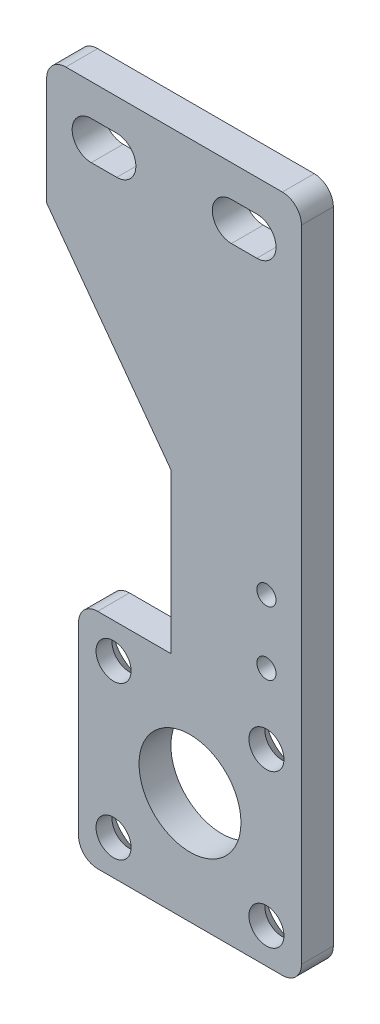
ISO-10303-21;
HEADER;
FILE_DESCRIPTION(('STEP AP214'),'2;1');
FILE_NAME('part.step','',(''),(''),'','','');
FILE_SCHEMA(('AUTOMOTIVE_DESIGN { 1 0 10303 214 1 1 1 1 }'));
ENDSEC;
DATA;
#1=APPLICATION_CONTEXT('core data for automotive mechanical design processes');
#2=APPLICATION_PROTOCOL_DEFINITION('international standard','automotive_design',2000,#1);
#3=PRODUCT_CONTEXT('',#1,'mechanical');
#4=PRODUCT('Part','Part','',(#3));
#5=PRODUCT_RELATED_PRODUCT_CATEGORY('part','',(#4));
#6=PRODUCT_DEFINITION_FORMATION('','',#4);
#7=PRODUCT_DEFINITION_CONTEXT('part definition',#1,'design');
#8=PRODUCT_DEFINITION('design','',#6,#7);
#9=PRODUCT_DEFINITION_SHAPE('','',#8);
#10=(LENGTH_UNIT() NAMED_UNIT(*) SI_UNIT(.MILLI.,.METRE.));
#11=(NAMED_UNIT(*) PLANE_ANGLE_UNIT() SI_UNIT($,.RADIAN.));
#12=(NAMED_UNIT(*) SI_UNIT($,.STERADIAN.) SOLID_ANGLE_UNIT());
#13=UNCERTAINTY_MEASURE_WITH_UNIT(LENGTH_MEASURE(1.E-05),#10,'distance_accuracy_value','');
#14=(GEOMETRIC_REPRESENTATION_CONTEXT(3) GLOBAL_UNCERTAINTY_ASSIGNED_CONTEXT((#13)) GLOBAL_UNIT_ASSIGNED_CONTEXT((#10,
#11,#12)) REPRESENTATION_CONTEXT('',''));
#15=CARTESIAN_POINT('',(0.,0.,0.));
#16=DIRECTION('',(0.,0.,1.));
#17=DIRECTION('',(1.,0.,0.));
#18=AXIS2_PLACEMENT_3D('',#15,#16,#17);
#19=CARTESIAN_POINT('',(1728.42054759342,1040.06548881727,5.));
#20=DIRECTION('',(0.,1.,0.));
#21=DIRECTION('',(-1.,0.,0.));
#22=AXIS2_PLACEMENT_3D('',#19,#20,#21);
#23=PLANE('',#22);
#24=DIRECTION('',(1.,0.,0.));
#25=VECTOR('',#24,1.);
#26=CARTESIAN_POINT('',(1728.42054759342,1040.06548881727,0.));
#27=LINE('',#26,#25);
#28=CARTESIAN_POINT('',(1716.42054759342,1040.06548881727,0.));
#29=VERTEX_POINT('',#28);
#30=CARTESIAN_POINT('',(1727.92054759342,1040.06548881727,0.));
#31=VERTEX_POINT('',#30);
#32=EDGE_CURVE('E246',#29,#31,#27,.T.);
#33=ORIENTED_EDGE('',*,*,#32,.F.);
#34=DIRECTION('',(0.,0.,-1.));
#35=VECTOR('',#34,1.);
#36=CARTESIAN_POINT('',(1716.42054759342,1040.06548881727,5.));
#37=LINE('',#36,#35);
#38=CARTESIAN_POINT('',(1716.42054759342,1040.06548881727,5.));
#39=VERTEX_POINT('',#38);
#40=EDGE_CURVE('E308',#39,#29,#37,.T.);
#41=ORIENTED_EDGE('',*,*,#40,.F.);
#42=DIRECTION('',(1.,0.,0.));
#43=VECTOR('',#42,1.);
#44=CARTESIAN_POINT('',(1728.42054759342,1040.06548881727,5.));
#45=LINE('',#44,#43);
#46=CARTESIAN_POINT('',(1727.92054759342,1040.06548881727,5.));
#47=VERTEX_POINT('',#46);
#48=EDGE_CURVE('E503',#39,#47,#45,.T.);
#49=ORIENTED_EDGE('',*,*,#48,.T.);
#50=DIRECTION('',(0.,0.,-1.));
#51=VECTOR('',#50,1.);
#52=CARTESIAN_POINT('',(1727.92054759342,1040.06548881727,5.));
#53=LINE('',#52,#51);
#54=EDGE_CURVE('E49',#47,#31,#53,.T.);
#55=ORIENTED_EDGE('',*,*,#54,.T.);
#56=EDGE_LOOP('',(#33,#41,#49,#55));
#57=FACE_BOUND('',#56,.T.);
#58=ADVANCED_FACE('F32',(#57),#23,.T.);
#59=CARTESIAN_POINT('',(1716.42054759342,1037.06548881727,5.));
#60=DIRECTION('',(0.,0.,-1.));
#61=DIRECTION('',(-1.,0.,0.));
#62=AXIS2_PLACEMENT_3D('',#59,#60,#61);
#63=CYLINDRICAL_SURFACE('',#62,2.99999999999989);
#64=CARTESIAN_POINT('',(1716.42054759342,1037.06548881727,0.));
#65=DIRECTION('',(0.,0.,1.));
#66=DIRECTION('',(1.,0.,0.));
#67=AXIS2_PLACEMENT_3D('',#64,#65,#66);
#68=CIRCLE('',#67,2.99999999999989);
#69=CARTESIAN_POINT('',(1713.42054759342,1037.06548881727,0.));
#70=VERTEX_POINT('',#69);
#71=EDGE_CURVE('E248',#29,#70,#68,.T.);
#72=ORIENTED_EDGE('',*,*,#71,.T.);
#73=DIRECTION('',(0.,0.,-1.));
#74=VECTOR('',#73,1.);
#75=CARTESIAN_POINT('',(1713.42054759342,1037.06548881727,5.));
#76=LINE('',#75,#74);
#77=CARTESIAN_POINT('',(1713.42054759342,1037.06548881727,5.));
#78=VERTEX_POINT('',#77);
#79=EDGE_CURVE('E305',#78,#70,#76,.T.);
#80=ORIENTED_EDGE('',*,*,#79,.F.);
#81=CARTESIAN_POINT('',(1716.42054759342,1037.06548881727,5.));
#82=DIRECTION('',(0.,0.,1.));
#83=DIRECTION('',(1.,0.,0.));
#84=AXIS2_PLACEMENT_3D('',#81,#82,#83);
#85=CIRCLE('',#84,2.99999999999989);
#86=EDGE_CURVE('E505',#39,#78,#85,.T.);
#87=ORIENTED_EDGE('',*,*,#86,.F.);
#88=ORIENTED_EDGE('',*,*,#40,.T.);
#89=EDGE_LOOP('',(#72,#80,#87,#88));
#90=FACE_BOUND('',#89,.T.);
#91=ADVANCED_FACE('F388',(#90),#63,.T.);
#92=CARTESIAN_POINT('',(1713.42054759342,969.686434144277,5.));
#93=DIRECTION('',(1.,0.,0.));
#94=DIRECTION('',(0.,1.,0.));
#95=AXIS2_PLACEMENT_3D('',#92,#93,#94);
#96=PLANE('',#95);
#97=DIRECTION('',(0.,-1.,0.));
#98=VECTOR('',#97,1.);
#99=CARTESIAN_POINT('',(1713.42054759342,969.686434144277,0.));
#100=LINE('',#99,#98);
#101=CARTESIAN_POINT('',(1713.42054759342,1008.06548881727,0.));
#102=VERTEX_POINT('',#101);
#103=EDGE_CURVE('E251',#70,#102,#100,.T.);
#104=ORIENTED_EDGE('',*,*,#103,.T.);
#105=DIRECTION('',(0.,0.,-1.));
#106=VECTOR('',#105,1.);
#107=CARTESIAN_POINT('',(1713.42054759342,1008.06548881727,5.));
#108=LINE('',#107,#106);
#109=CARTESIAN_POINT('',(1713.42054759342,1008.06548881727,5.));
#110=VERTEX_POINT('',#109);
#111=EDGE_CURVE('E302',#110,#102,#108,.T.);
#112=ORIENTED_EDGE('',*,*,#111,.F.);
#113=DIRECTION('',(0.,-1.,0.));
#114=VECTOR('',#113,1.);
#115=CARTESIAN_POINT('',(1713.42054759342,969.686434144277,5.));
#116=LINE('',#115,#114);
#117=EDGE_CURVE('E508',#78,#110,#116,.T.);
#118=ORIENTED_EDGE('',*,*,#117,.F.);
#119=ORIENTED_EDGE('',*,*,#79,.T.);
#120=EDGE_LOOP('',(#104,#112,#118,#119));
#121=FACE_BOUND('',#120,.T.);
#122=ADVANCED_FACE('F393',(#121),#96,.F.);
#123=CARTESIAN_POINT('',(1716.42054759342,1008.06548881727,5.));
#124=DIRECTION('',(0.,0.,-1.));
#125=DIRECTION('',(-1.,0.,0.));
#126=AXIS2_PLACEMENT_3D('',#123,#124,#125);
#127=CYLINDRICAL_SURFACE('',#126,2.99999999999989);
#128=CARTESIAN_POINT('',(1716.42054759342,1008.06548881727,0.));
#129=DIRECTION('',(0.,0.,1.));
#130=DIRECTION('',(1.,0.,0.));
#131=AXIS2_PLACEMENT_3D('',#128,#129,#130);
#132=CIRCLE('',#131,2.99999999999989);
#133=CARTESIAN_POINT('',(1716.42054759342,1005.06548881727,0.));
#134=VERTEX_POINT('',#133);
#135=EDGE_CURVE('E254',#102,#134,#132,.T.);
#136=ORIENTED_EDGE('',*,*,#135,.T.);
#137=DIRECTION('',(0.,0.,-1.));
#138=VECTOR('',#137,1.);
#139=CARTESIAN_POINT('',(1716.42054759342,1005.06548881727,5.));
#140=LINE('',#139,#138);
#141=CARTESIAN_POINT('',(1716.42054759342,1005.06548881727,5.));
#142=VERTEX_POINT('',#141);
#143=EDGE_CURVE('E299',#142,#134,#140,.T.);
#144=ORIENTED_EDGE('',*,*,#143,.F.);
#145=CARTESIAN_POINT('',(1716.42054759342,1008.06548881727,5.));
#146=DIRECTION('',(0.,0.,1.));
#147=DIRECTION('',(1.,0.,0.));
#148=AXIS2_PLACEMENT_3D('',#145,#146,#147);
#149=CIRCLE('',#148,2.99999999999989);
#150=EDGE_CURVE('E511',#110,#142,#149,.T.);
#151=ORIENTED_EDGE('',*,*,#150,.F.);
#152=ORIENTED_EDGE('',*,*,#111,.T.);
#153=EDGE_LOOP('',(#136,#144,#151,#152));
#154=FACE_BOUND('',#153,.T.);
#155=ADVANCED_FACE('F557',(#154),#127,.T.);
#156=CARTESIAN_POINT('',(1728.42054759342,1005.06548881727,5.));
#157=DIRECTION('',(0.,1.,0.));
#158=DIRECTION('',(-1.,0.,0.));
#159=AXIS2_PLACEMENT_3D('',#156,#157,#158);
#160=PLANE('',#159);
#161=DIRECTION('',(1.,0.,0.));
#162=VECTOR('',#161,1.);
#163=CARTESIAN_POINT('',(1728.42054759342,1005.06548881727,0.));
#164=LINE('',#163,#162);
#165=CARTESIAN_POINT('',(1745.42054759342,1005.06548881727,0.));
#166=VERTEX_POINT('',#165);
#167=EDGE_CURVE('E257',#134,#166,#164,.T.);
#168=ORIENTED_EDGE('',*,*,#167,.T.);
#169=DIRECTION('',(0.,0.,-1.));
#170=VECTOR('',#169,1.);
#171=CARTESIAN_POINT('',(1745.42054759342,1005.06548881727,5.));
#172=LINE('',#171,#170);
#173=CARTESIAN_POINT('',(1745.42054759342,1005.06548881727,5.));
#174=VERTEX_POINT('',#173);
#175=EDGE_CURVE('E296',#174,#166,#172,.T.);
#176=ORIENTED_EDGE('',*,*,#175,.F.);
#177=DIRECTION('',(1.,0.,0.));
#178=VECTOR('',#177,1.);
#179=CARTESIAN_POINT('',(1728.42054759342,1005.06548881727,5.));
#180=LINE('',#179,#178);
#181=EDGE_CURVE('E514',#142,#174,#180,.T.);
#182=ORIENTED_EDGE('',*,*,#181,.F.);
#183=ORIENTED_EDGE('',*,*,#143,.T.);
#184=EDGE_LOOP('',(#168,#176,#182,#183));
#185=FACE_BOUND('',#184,.T.);
#186=ADVANCED_FACE('F553',(#185),#160,.F.);
#187=CARTESIAN_POINT('',(1745.42054759342,1008.06548881727,5.));
#188=DIRECTION('',(0.,0.,-1.));
#189=DIRECTION('',(-1.,0.,0.));
#190=AXIS2_PLACEMENT_3D('',#187,#188,#189);
#191=CYLINDRICAL_SURFACE('',#190,3.);
#192=CARTESIAN_POINT('',(1745.42054759342,1008.06548881727,0.));
#193=DIRECTION('',(0.,0.,1.));
#194=DIRECTION('',(1.,0.,0.));
#195=AXIS2_PLACEMENT_3D('',#192,#193,#194);
#196=CIRCLE('',#195,3.);
#197=CARTESIAN_POINT('',(1748.42054759342,1008.06548881727,0.));
#198=VERTEX_POINT('',#197);
#199=EDGE_CURVE('E260',#166,#198,#196,.T.);
#200=ORIENTED_EDGE('',*,*,#199,.T.);
#201=DIRECTION('',(0.,0.,-1.));
#202=VECTOR('',#201,1.);
#203=CARTESIAN_POINT('',(1748.42054759342,1008.06548881727,5.));
#204=LINE('',#203,#202);
#205=CARTESIAN_POINT('',(1748.42054759342,1008.06548881727,5.));
#206=VERTEX_POINT('',#205);
#207=EDGE_CURVE('E293',#206,#198,#204,.T.);
#208=ORIENTED_EDGE('',*,*,#207,.F.);
#209=CARTESIAN_POINT('',(1745.42054759342,1008.06548881727,5.));
#210=DIRECTION('',(0.,0.,1.));
#211=DIRECTION('',(1.,0.,0.));
#212=AXIS2_PLACEMENT_3D('',#209,#210,#211);
#213=CIRCLE('',#212,3.);
#214=EDGE_CURVE('E517',#174,#206,#213,.T.);
#215=ORIENTED_EDGE('',*,*,#214,.F.);
#216=ORIENTED_EDGE('',*,*,#175,.T.);
#217=EDGE_LOOP('',(#200,#208,#215,#216));
#218=FACE_BOUND('',#217,.T.);
#219=ADVANCED_FACE('F549',(#218),#191,.T.);
#220=CARTESIAN_POINT('',(1748.42054759342,969.686434144277,5.));
#221=DIRECTION('',(-1.,0.,0.));
#222=DIRECTION('',(0.,0.,1.));
#223=AXIS2_PLACEMENT_3D('',#220,#221,#222);
#224=PLANE('',#223);
#225=DIRECTION('',(0.,1.,0.));
#226=VECTOR('',#225,1.);
#227=CARTESIAN_POINT('',(1748.42054759342,969.686434144277,0.));
#228=LINE('',#227,#226);
#229=CARTESIAN_POINT('',(1748.42054759342,1108.56548881727,0.));
#230=VERTEX_POINT('',#229);
#231=EDGE_CURVE('E263',#198,#230,#228,.T.);
#232=ORIENTED_EDGE('',*,*,#231,.T.);
#233=DIRECTION('',(0.,0.,-1.));
#234=VECTOR('',#233,1.);
#235=CARTESIAN_POINT('',(1748.42054759342,1108.56548881727,5.));
#236=LINE('',#235,#234);
#237=CARTESIAN_POINT('',(1748.42054759342,1108.56548881727,5.));
#238=VERTEX_POINT('',#237);
#239=EDGE_CURVE('E290',#238,#230,#236,.T.);
#240=ORIENTED_EDGE('',*,*,#239,.F.);
#241=DIRECTION('',(0.,1.,0.));
#242=VECTOR('',#241,1.);
#243=CARTESIAN_POINT('',(1748.42054759342,969.686434144277,5.));
#244=LINE('',#243,#242);
#245=EDGE_CURVE('E520',#206,#238,#244,.T.);
#246=ORIENTED_EDGE('',*,*,#245,.F.);
#247=ORIENTED_EDGE('',*,*,#207,.T.);
#248=EDGE_LOOP('',(#232,#240,#246,#247));
#249=FACE_BOUND('',#248,.T.);
#250=ADVANCED_FACE('F546',(#249),#224,.F.);
#251=CARTESIAN_POINT('',(1745.42054759342,1108.56548881727,5.));
#252=DIRECTION('',(0.,0.,-1.));
#253=DIRECTION('',(-1.,0.,0.));
#254=AXIS2_PLACEMENT_3D('',#251,#252,#253);
#255=CYLINDRICAL_SURFACE('',#254,2.99999999999978);
#256=CARTESIAN_POINT('',(1745.42054759342,1108.56548881727,0.));
#257=DIRECTION('',(0.,0.,1.));
#258=DIRECTION('',(1.,0.,0.));
#259=AXIS2_PLACEMENT_3D('',#256,#257,#258);
#260=CIRCLE('',#259,2.99999999999978);
#261=CARTESIAN_POINT('',(1745.42054759342,1111.56548881727,0.));
#262=VERTEX_POINT('',#261);
#263=EDGE_CURVE('E266',#230,#262,#260,.T.);
#264=ORIENTED_EDGE('',*,*,#263,.T.);
#265=DIRECTION('',(0.,0.,-1.));
#266=VECTOR('',#265,1.);
#267=CARTESIAN_POINT('',(1745.42054759342,1111.56548881727,5.));
#268=LINE('',#267,#266);
#269=CARTESIAN_POINT('',(1745.42054759342,1111.56548881727,5.));
#270=VERTEX_POINT('',#269);
#271=EDGE_CURVE('E288',#270,#262,#268,.T.);
#272=ORIENTED_EDGE('',*,*,#271,.F.);
#273=CARTESIAN_POINT('',(1745.42054759342,1108.56548881727,5.));
#274=DIRECTION('',(0.,0.,1.));
#275=DIRECTION('',(1.,0.,0.));
#276=AXIS2_PLACEMENT_3D('',#273,#274,#275);
#277=CIRCLE('',#276,2.99999999999978);
#278=EDGE_CURVE('E523',#238,#270,#277,.T.);
#279=ORIENTED_EDGE('',*,*,#278,.F.);
#280=ORIENTED_EDGE('',*,*,#239,.T.);
#281=EDGE_LOOP('',(#264,#272,#279,#280));
#282=FACE_BOUND('',#281,.T.);
#283=ADVANCED_FACE('F531',(#282),#255,.T.);
#284=CARTESIAN_POINT('',(1728.42054759342,1111.56548881727,5.));
#285=DIRECTION('',(0.,1.,0.));
#286=DIRECTION('',(-1.,0.,0.));
#287=AXIS2_PLACEMENT_3D('',#284,#285,#286);
#288=PLANE('',#287);
#289=DIRECTION('',(1.,0.,0.));
#290=VECTOR('',#289,1.);
#291=CARTESIAN_POINT('',(1728.42054759342,1111.56548881727,0.));
#292=LINE('',#291,#290);
#293=CARTESIAN_POINT('',(1711.42054759342,1111.56548881727,0.));
#294=VERTEX_POINT('',#293);
#295=EDGE_CURVE('E269',#294,#262,#292,.T.);
#296=ORIENTED_EDGE('',*,*,#295,.F.);
#297=DIRECTION('',(0.,0.,-1.));
#298=VECTOR('',#297,1.);
#299=CARTESIAN_POINT('',(1711.42054759342,1111.56548881727,5.));
#300=LINE('',#299,#298);
#301=CARTESIAN_POINT('',(1711.42054759342,1111.56548881727,5.));
#302=VERTEX_POINT('',#301);
#303=EDGE_CURVE('E286',#302,#294,#300,.T.);
#304=ORIENTED_EDGE('',*,*,#303,.F.);
#305=DIRECTION('',(1.,0.,0.));
#306=VECTOR('',#305,1.);
#307=CARTESIAN_POINT('',(1728.42054759342,1111.56548881727,5.));
#308=LINE('',#307,#306);
#309=EDGE_CURVE('E207',#302,#270,#308,.T.);
#310=ORIENTED_EDGE('',*,*,#309,.T.);
#311=ORIENTED_EDGE('',*,*,#271,.T.);
#312=EDGE_LOOP('',(#296,#304,#310,#311));
#313=FACE_BOUND('',#312,.T.);
#314=ADVANCED_FACE('F527',(#313),#288,.T.);
#315=CARTESIAN_POINT('',(1711.42054759342,1108.56548881727,5.));
#316=DIRECTION('',(0.,0.,-1.));
#317=DIRECTION('',(-1.,0.,0.));
#318=AXIS2_PLACEMENT_3D('',#315,#316,#317);
#319=CYLINDRICAL_SURFACE('',#318,3.00000000000011);
#320=CARTESIAN_POINT('',(1711.42054759342,1108.56548881727,0.));
#321=DIRECTION('',(0.,0.,1.));
#322=DIRECTION('',(1.,0.,0.));
#323=AXIS2_PLACEMENT_3D('',#320,#321,#322);
#324=CIRCLE('',#323,3.00000000000011);
#325=CARTESIAN_POINT('',(1708.42054759342,1108.56548881727,0.));
#326=VERTEX_POINT('',#325);
#327=EDGE_CURVE('E272',#294,#326,#324,.T.);
#328=ORIENTED_EDGE('',*,*,#327,.T.);
#329=DIRECTION('',(0.,0.,-1.));
#330=VECTOR('',#329,1.);
#331=CARTESIAN_POINT('',(1708.42054759342,1108.56548881727,5.));
#332=LINE('',#331,#330);
#333=CARTESIAN_POINT('',(1708.42054759342,1108.56548881727,5.));
#334=VERTEX_POINT('',#333);
#335=EDGE_CURVE('E192',#334,#326,#332,.T.);
#336=ORIENTED_EDGE('',*,*,#335,.F.);
#337=CARTESIAN_POINT('',(1711.42054759342,1108.56548881727,5.));
#338=DIRECTION('',(0.,0.,1.));
#339=DIRECTION('',(1.,0.,0.));
#340=AXIS2_PLACEMENT_3D('',#337,#338,#339);
#341=CIRCLE('',#340,3.00000000000011);
#342=EDGE_CURVE('E204',#302,#334,#341,.T.);
#343=ORIENTED_EDGE('',*,*,#342,.F.);
#344=ORIENTED_EDGE('',*,*,#303,.T.);
#345=EDGE_LOOP('',(#328,#336,#343,#344));
#346=FACE_BOUND('',#345,.T.);
#347=ADVANCED_FACE('F534',(#346),#319,.T.);
#348=CARTESIAN_POINT('',(1708.42054759342,969.686434144277,5.));
#349=DIRECTION('',(-1.,0.,0.));
#350=DIRECTION('',(0.,0.,1.));
#351=AXIS2_PLACEMENT_3D('',#348,#349,#350);
#352=PLANE('',#351);
#353=DIRECTION('',(0.,1.,0.));
#354=VECTOR('',#353,1.);
#355=CARTESIAN_POINT('',(1708.42054759342,969.686434144277,0.));
#356=LINE('',#355,#354);
#357=CARTESIAN_POINT('',(1708.42054759342,1091.56548881727,0.));
#358=VERTEX_POINT('',#357);
#359=EDGE_CURVE('E189',#358,#326,#356,.T.);
#360=ORIENTED_EDGE('',*,*,#359,.F.);
#361=DIRECTION('',(0.,0.,-1.));
#362=VECTOR('',#361,1.);
#363=CARTESIAN_POINT('',(1708.42054759342,1091.56548881727,5.));
#364=LINE('',#363,#362);
#365=CARTESIAN_POINT('',(1708.42054759342,1091.56548881727,5.));
#366=VERTEX_POINT('',#365);
#367=EDGE_CURVE('E183',#366,#358,#364,.T.);
#368=ORIENTED_EDGE('',*,*,#367,.F.);
#369=DIRECTION('',(0.,1.,0.));
#370=VECTOR('',#369,1.);
#371=CARTESIAN_POINT('',(1708.42054759342,969.686434144277,5.));
#372=LINE('',#371,#370);
#373=EDGE_CURVE('E187',#366,#334,#372,.T.);
#374=ORIENTED_EDGE('',*,*,#373,.T.);
#375=ORIENTED_EDGE('',*,*,#335,.T.);
#376=EDGE_LOOP('',(#360,#368,#374,#375));
#377=FACE_BOUND('',#376,.T.);
#378=ADVANCED_FACE('F185',(#377),#352,.T.);
#379=CARTESIAN_POINT('',(1773.6270154939,1002.95157090123,5.));
#380=DIRECTION('',(0.80543764013598,0.592680527647218,0.));
#381=DIRECTION('',(-0.592680527647218,0.80543764013598,0.));
#382=AXIS2_PLACEMENT_3D('',#379,#380,#381);
#383=PLANE('',#382);
#384=DIRECTION('',(0.592680527647218,-0.80543764013598,0.));
#385=VECTOR('',#384,1.);
#386=CARTESIAN_POINT('',(1773.6270154939,1002.95157090123,0.));
#387=LINE('',#386,#385);
#388=CARTESIAN_POINT('',(1727.92054759342,1065.06548881727,0.));
#389=VERTEX_POINT('',#388);
#390=EDGE_CURVE('E276',#358,#389,#387,.T.);
#391=ORIENTED_EDGE('',*,*,#390,.T.);
#392=DIRECTION('',(0.,0.,-1.));
#393=VECTOR('',#392,1.);
#394=CARTESIAN_POINT('',(1727.92054759342,1065.06548881727,5.));
#395=LINE('',#394,#393);
#396=CARTESIAN_POINT('',(1727.92054759342,1065.06548881727,5.));
#397=VERTEX_POINT('',#396);
#398=EDGE_CURVE('E115',#397,#389,#395,.T.);
#399=ORIENTED_EDGE('',*,*,#398,.F.);
#400=DIRECTION('',(0.592680527647218,-0.80543764013598,0.));
#401=VECTOR('',#400,1.);
#402=CARTESIAN_POINT('',(1773.6270154939,1002.95157090123,5.));
#403=LINE('',#402,#401);
#404=EDGE_CURVE('E194',#366,#397,#403,.T.);
#405=ORIENTED_EDGE('',*,*,#404,.F.);
#406=ORIENTED_EDGE('',*,*,#367,.T.);
#407=EDGE_LOOP('',(#391,#399,#405,#406));
#408=FACE_BOUND('',#407,.T.);
#409=ADVANCED_FACE('F195',(#408),#383,.F.);
#410=CARTESIAN_POINT('',(1741.42054759342,1103.56548881727,5.));
#411=DIRECTION('',(0.,0.,-1.));
#412=DIRECTION('',(-1.,0.,0.));
#413=AXIS2_PLACEMENT_3D('',#410,#411,#412);
#414=CYLINDRICAL_SURFACE('',#413,3.);
#415=CARTESIAN_POINT('',(1741.42054759342,1103.56548881727,0.));
#416=DIRECTION('',(0.,0.,1.));
#417=DIRECTION('',(1.,0.,0.));
#418=AXIS2_PLACEMENT_3D('',#415,#416,#417);
#419=CIRCLE('',#418,3.);
#420=CARTESIAN_POINT('',(1741.42054759342,1100.56548881727,0.));
#421=VERTEX_POINT('',#420);
#422=CARTESIAN_POINT('',(1741.42054759342,1106.56548881727,0.));
#423=VERTEX_POINT('',#422);
#424=EDGE_CURVE('E234',#421,#423,#419,.T.);
#425=ORIENTED_EDGE('',*,*,#424,.F.);
#426=DIRECTION('',(0.,0.,-1.));
#427=VECTOR('',#426,1.);
#428=CARTESIAN_POINT('',(1741.42054759342,1100.56548881727,5.));
#429=LINE('',#428,#427);
#430=CARTESIAN_POINT('',(1741.42054759342,1100.56548881727,5.));
#431=VERTEX_POINT('',#430);
#432=EDGE_CURVE('E283',#431,#421,#429,.T.);
#433=ORIENTED_EDGE('',*,*,#432,.F.);
#434=CARTESIAN_POINT('',(1741.42054759342,1103.56548881727,5.));
#435=DIRECTION('',(0.,0.,1.));
#436=DIRECTION('',(1.,0.,0.));
#437=AXIS2_PLACEMENT_3D('',#434,#435,#436);
#438=CIRCLE('',#437,3.);
#439=CARTESIAN_POINT('',(1741.42054759342,1106.56548881727,5.));
#440=VERTEX_POINT('',#439);
#441=EDGE_CURVE('E493',#431,#440,#438,.T.);
#442=ORIENTED_EDGE('',*,*,#441,.T.);
#443=DIRECTION('',(0.,0.,-1.));
#444=VECTOR('',#443,1.);
#445=CARTESIAN_POINT('',(1741.42054759342,1106.56548881727,5.));
#446=LINE('',#445,#444);
#447=EDGE_CURVE('E311',#440,#423,#446,.T.);
#448=ORIENTED_EDGE('',*,*,#447,.T.);
#449=EDGE_LOOP('',(#425,#433,#442,#448));
#450=FACE_BOUND('',#449,.T.);
#451=ADVANCED_FACE('F412',(#450),#414,.F.);
#452=CARTESIAN_POINT('',(1728.42054759342,1100.56548881727,5.));
#453=DIRECTION('',(0.,-1.,0.));
#454=DIRECTION('',(0.,0.,-1.));
#455=AXIS2_PLACEMENT_3D('',#452,#453,#454);
#456=PLANE('',#455);
#457=DIRECTION('',(-1.,0.,0.));
#458=VECTOR('',#457,1.);
#459=CARTESIAN_POINT('',(1728.42054759342,1100.56548881727,0.));
#460=LINE('',#459,#458);
#461=CARTESIAN_POINT('',(1737.42054759342,1100.56548881727,0.));
#462=VERTEX_POINT('',#461);
#463=EDGE_CURVE('E237',#421,#462,#460,.T.);
#464=ORIENTED_EDGE('',*,*,#463,.T.);
#465=DIRECTION('',(0.,0.,-1.));
#466=VECTOR('',#465,1.);
#467=CARTESIAN_POINT('',(1737.42054759342,1100.56548881727,5.));
#468=LINE('',#467,#466);
#469=CARTESIAN_POINT('',(1737.42054759342,1100.56548881727,5.));
#470=VERTEX_POINT('',#469);
#471=EDGE_CURVE('E315',#470,#462,#468,.T.);
#472=ORIENTED_EDGE('',*,*,#471,.F.);
#473=DIRECTION('',(-1.,0.,0.));
#474=VECTOR('',#473,1.);
#475=CARTESIAN_POINT('',(1728.42054759342,1100.56548881727,5.));
#476=LINE('',#475,#474);
#477=EDGE_CURVE('E496',#431,#470,#476,.T.);
#478=ORIENTED_EDGE('',*,*,#477,.F.);
#479=ORIENTED_EDGE('',*,*,#432,.T.);
#480=EDGE_LOOP('',(#464,#472,#478,#479));
#481=FACE_BOUND('',#480,.T.);
#482=ADVANCED_FACE('F408',(#481),#456,.F.);
#483=CARTESIAN_POINT('',(1737.42054759342,1103.56548881727,5.));
#484=DIRECTION('',(0.,0.,-1.));
#485=DIRECTION('',(-1.,0.,0.));
#486=AXIS2_PLACEMENT_3D('',#483,#484,#485);
#487=CYLINDRICAL_SURFACE('',#486,3.);
#488=CARTESIAN_POINT('',(1737.42054759342,1103.56548881727,0.));
#489=DIRECTION('',(0.,0.,1.));
#490=DIRECTION('',(1.,0.,0.));
#491=AXIS2_PLACEMENT_3D('',#488,#489,#490);
#492=CIRCLE('',#491,3.);
#493=CARTESIAN_POINT('',(1737.42054759342,1106.56548881727,0.));
#494=VERTEX_POINT('',#493);
#495=EDGE_CURVE('E240',#494,#462,#492,.T.);
#496=ORIENTED_EDGE('',*,*,#495,.F.);
#497=DIRECTION('',(0.,0.,-1.));
#498=VECTOR('',#497,1.);
#499=CARTESIAN_POINT('',(1737.42054759342,1106.56548881727,5.));
#500=LINE('',#499,#498);
#501=CARTESIAN_POINT('',(1737.42054759342,1106.56548881727,5.));
#502=VERTEX_POINT('',#501);
#503=EDGE_CURVE('E313',#502,#494,#500,.T.);
#504=ORIENTED_EDGE('',*,*,#503,.F.);
#505=CARTESIAN_POINT('',(1737.42054759342,1103.56548881727,5.));
#506=DIRECTION('',(0.,0.,1.));
#507=DIRECTION('',(1.,0.,0.));
#508=AXIS2_PLACEMENT_3D('',#505,#506,#507);
#509=CIRCLE('',#508,3.);
#510=EDGE_CURVE('E498',#502,#470,#509,.T.);
#511=ORIENTED_EDGE('',*,*,#510,.T.);
#512=ORIENTED_EDGE('',*,*,#471,.T.);
#513=EDGE_LOOP('',(#496,#504,#511,#512));
#514=FACE_BOUND('',#513,.T.);
#515=ADVANCED_FACE('F404',(#514),#487,.F.);
#516=CARTESIAN_POINT('',(1719.42054759342,1103.56548881727,5.));
#517=DIRECTION('',(0.,0.,-1.));
#518=DIRECTION('',(-1.,0.,0.));
#519=AXIS2_PLACEMENT_3D('',#516,#517,#518);
#520=CYLINDRICAL_SURFACE('',#519,3.);
#521=CARTESIAN_POINT('',(1719.42054759342,1103.56548881727,0.));
#522=DIRECTION('',(0.,0.,1.));
#523=DIRECTION('',(1.,0.,0.));
#524=AXIS2_PLACEMENT_3D('',#521,#522,#523);
#525=CIRCLE('',#524,3.);
#526=CARTESIAN_POINT('',(1719.42054759342,1100.56548881727,0.));
#527=VERTEX_POINT('',#526);
#528=CARTESIAN_POINT('',(1719.42054759342,1106.56548881727,0.));
#529=VERTEX_POINT('',#528);
#530=EDGE_CURVE('E222',#527,#529,#525,.T.);
#531=ORIENTED_EDGE('',*,*,#530,.F.);
#532=DIRECTION('',(0.,0.,-1.));
#533=VECTOR('',#532,1.);
#534=CARTESIAN_POINT('',(1719.42054759342,1100.56548881727,5.));
#535=LINE('',#534,#533);
#536=CARTESIAN_POINT('',(1719.42054759342,1100.56548881727,5.));
#537=VERTEX_POINT('',#536);
#538=EDGE_CURVE('E127',#537,#527,#535,.T.);
#539=ORIENTED_EDGE('',*,*,#538,.F.);
#540=CARTESIAN_POINT('',(1719.42054759342,1103.56548881727,5.));
#541=DIRECTION('',(0.,0.,1.));
#542=DIRECTION('',(1.,0.,0.));
#543=AXIS2_PLACEMENT_3D('',#540,#541,#542);
#544=CIRCLE('',#543,3.);
#545=CARTESIAN_POINT('',(1719.42054759342,1106.56548881727,5.));
#546=VERTEX_POINT('',#545);
#547=EDGE_CURVE('E482',#537,#546,#544,.T.);
#548=ORIENTED_EDGE('',*,*,#547,.T.);
#549=DIRECTION('',(0.,0.,-1.));
#550=VECTOR('',#549,1.);
#551=CARTESIAN_POINT('',(1719.42054759342,1106.56548881727,5.));
#552=LINE('',#551,#550);
#553=EDGE_CURVE('E212',#546,#529,#552,.T.);
#554=ORIENTED_EDGE('',*,*,#553,.T.);
#555=EDGE_LOOP('',(#531,#539,#548,#554));
#556=FACE_BOUND('',#555,.T.);
#557=ADVANCED_FACE('F407',(#556),#520,.F.);
#558=CARTESIAN_POINT('',(1728.42054759342,1100.56548881727,5.));
#559=DIRECTION('',(0.,1.,0.));
#560=DIRECTION('',(0.,0.,1.));
#561=AXIS2_PLACEMENT_3D('',#558,#559,#560);
#562=PLANE('',#561);
#563=DIRECTION('',(1.,0.,0.));
#564=VECTOR('',#563,1.);
#565=CARTESIAN_POINT('',(1728.42054759342,1100.56548881727,0.));
#566=LINE('',#565,#564);
#567=CARTESIAN_POINT('',(1715.42054759342,1100.56548881727,0.));
#568=VERTEX_POINT('',#567);
#569=EDGE_CURVE('E225',#568,#527,#566,.T.);
#570=ORIENTED_EDGE('',*,*,#569,.F.);
#571=DIRECTION('',(0.,0.,-1.));
#572=VECTOR('',#571,1.);
#573=CARTESIAN_POINT('',(1715.42054759342,1100.56548881727,5.));
#574=LINE('',#573,#572);
#575=CARTESIAN_POINT('',(1715.42054759342,1100.56548881727,5.));
#576=VERTEX_POINT('',#575);
#577=EDGE_CURVE('E321',#576,#568,#574,.T.);
#578=ORIENTED_EDGE('',*,*,#577,.F.);
#579=DIRECTION('',(1.,0.,0.));
#580=VECTOR('',#579,1.);
#581=CARTESIAN_POINT('',(1728.42054759342,1100.56548881727,5.));
#582=LINE('',#581,#580);
#583=EDGE_CURVE('E484',#576,#537,#582,.T.);
#584=ORIENTED_EDGE('',*,*,#583,.T.);
#585=ORIENTED_EDGE('',*,*,#538,.T.);
#586=EDGE_LOOP('',(#570,#578,#584,#585));
#587=FACE_BOUND('',#586,.T.);
#588=ADVANCED_FACE('F423',(#587),#562,.T.);
#589=CARTESIAN_POINT('',(1715.42054759342,1103.56548881727,5.));
#590=DIRECTION('',(0.,0.,-1.));
#591=DIRECTION('',(-1.,0.,0.));
#592=AXIS2_PLACEMENT_3D('',#589,#590,#591);
#593=CYLINDRICAL_SURFACE('',#592,3.);
#594=CARTESIAN_POINT('',(1715.42054759342,1103.56548881727,0.));
#595=DIRECTION('',(0.,0.,1.));
#596=DIRECTION('',(1.,0.,0.));
#597=AXIS2_PLACEMENT_3D('',#594,#595,#596);
#598=CIRCLE('',#597,3.);
#599=CARTESIAN_POINT('',(1715.42054759342,1106.56548881727,0.));
#600=VERTEX_POINT('',#599);
#601=EDGE_CURVE('E228',#600,#568,#598,.T.);
#602=ORIENTED_EDGE('',*,*,#601,.F.);
#603=DIRECTION('',(0.,0.,-1.));
#604=VECTOR('',#603,1.);
#605=CARTESIAN_POINT('',(1715.42054759342,1106.56548881727,5.));
#606=LINE('',#605,#604);
#607=CARTESIAN_POINT('',(1715.42054759342,1106.56548881727,5.));
#608=VERTEX_POINT('',#607);
#609=EDGE_CURVE('E319',#608,#600,#606,.T.);
#610=ORIENTED_EDGE('',*,*,#609,.F.);
#611=CARTESIAN_POINT('',(1715.42054759342,1103.56548881727,5.));
#612=DIRECTION('',(0.,0.,1.));
#613=DIRECTION('',(1.,0.,0.));
#614=AXIS2_PLACEMENT_3D('',#611,#612,#613);
#615=CIRCLE('',#614,3.);
#616=EDGE_CURVE('E487',#608,#576,#615,.T.);
#617=ORIENTED_EDGE('',*,*,#616,.T.);
#618=ORIENTED_EDGE('',*,*,#577,.T.);
#619=EDGE_LOOP('',(#602,#610,#617,#618));
#620=FACE_BOUND('',#619,.T.);
#621=ADVANCED_FACE('F402',(#620),#593,.F.);
#622=CARTESIAN_POINT('',(1728.42054759342,1106.56548881727,5.));
#623=DIRECTION('',(0.,1.,0.));
#624=DIRECTION('',(0.,0.,1.));
#625=AXIS2_PLACEMENT_3D('',#622,#623,#624);
#626=PLANE('',#625);
#627=DIRECTION('',(1.,0.,0.));
#628=VECTOR('',#627,1.);
#629=CARTESIAN_POINT('',(1728.42054759342,1106.56548881727,0.));
#630=LINE('',#629,#628);
#631=EDGE_CURVE('E243',#494,#423,#630,.T.);
#632=ORIENTED_EDGE('',*,*,#631,.T.);
#633=ORIENTED_EDGE('',*,*,#447,.F.);
#634=DIRECTION('',(1.,0.,0.));
#635=VECTOR('',#634,1.);
#636=CARTESIAN_POINT('',(1728.42054759342,1106.56548881727,5.));
#637=LINE('',#636,#635);
#638=EDGE_CURVE('E501',#502,#440,#637,.T.);
#639=ORIENTED_EDGE('',*,*,#638,.F.);
#640=ORIENTED_EDGE('',*,*,#503,.T.);
#641=EDGE_LOOP('',(#632,#633,#639,#640));
#642=FACE_BOUND('',#641,.T.);
#643=ADVANCED_FACE('F398',(#642),#626,.F.);
#644=CARTESIAN_POINT('',(1728.42054759342,1106.56548881727,5.));
#645=DIRECTION('',(0.,-1.,0.));
#646=DIRECTION('',(0.,0.,-1.));
#647=AXIS2_PLACEMENT_3D('',#644,#645,#646);
#648=PLANE('',#647);
#649=DIRECTION('',(-1.,0.,0.));
#650=VECTOR('',#649,1.);
#651=CARTESIAN_POINT('',(1728.42054759342,1106.56548881727,0.));
#652=LINE('',#651,#650);
#653=EDGE_CURVE('E231',#529,#600,#652,.T.);
#654=ORIENTED_EDGE('',*,*,#653,.F.);
#655=ORIENTED_EDGE('',*,*,#553,.F.);
#656=DIRECTION('',(-1.,0.,0.));
#657=VECTOR('',#656,1.);
#658=CARTESIAN_POINT('',(1728.42054759342,1106.56548881727,5.));
#659=LINE('',#658,#657);
#660=EDGE_CURVE('E490',#546,#608,#659,.T.);
#661=ORIENTED_EDGE('',*,*,#660,.T.);
#662=ORIENTED_EDGE('',*,*,#609,.T.);
#663=EDGE_LOOP('',(#654,#655,#661,#662));
#664=FACE_BOUND('',#663,.T.);
#665=ADVANCED_FACE('F401',(#664),#648,.T.);
#666=CARTESIAN_POINT('',(1730.92054759342,1022.56548881727,5.));
#667=DIRECTION('',(0.,0.,-1.));
#668=DIRECTION('',(-1.,0.,0.));
#669=AXIS2_PLACEMENT_3D('',#666,#667,#668);
#670=CYLINDRICAL_SURFACE('',#669,8.00000000000001);
#671=CARTESIAN_POINT('',(1730.92054759342,1022.56548881727,5.));
#672=DIRECTION('',(0.,0.,1.));
#673=DIRECTION('',(1.,0.,0.));
#674=AXIS2_PLACEMENT_3D('',#671,#672,#673);
#675=CIRCLE('',#674,8.00000000000001);
#676=CARTESIAN_POINT('',(1738.92054759342,1022.56548881727,5.));
#677=VERTEX_POINT('',#676);
#678=EDGE_CURVE('E479',#677,#677,#675,.T.);
#679=ORIENTED_EDGE('',*,*,#678,.T.);
#680=EDGE_LOOP('',(#679));
#681=FACE_BOUND('',#680,.T.);
#682=CARTESIAN_POINT('',(1730.92054759342,1022.56548881727,0.));
#683=DIRECTION('',(0.,0.,1.));
#684=DIRECTION('',(1.,0.,0.));
#685=AXIS2_PLACEMENT_3D('',#682,#683,#684);
#686=CIRCLE('',#685,8.00000000000001);
#687=CARTESIAN_POINT('',(1738.92054759342,1022.56548881727,0.));
#688=VERTEX_POINT('',#687);
#689=EDGE_CURVE('E219',#688,#688,#686,.T.);
#690=ORIENTED_EDGE('',*,*,#689,.F.);
#691=EDGE_LOOP('',(#690));
#692=FACE_BOUND('',#691,.T.);
#693=ADVANCED_FACE('F419',(#681,#692),#670,.F.);
#694=CARTESIAN_POINT('',(1742.92054759342,1034.56548881727,5.));
#695=DIRECTION('',(0.,0.,-1.));
#696=DIRECTION('',(-1.,0.,0.));
#697=AXIS2_PLACEMENT_3D('',#694,#695,#696);
#698=CYLINDRICAL_SURFACE('',#697,2.75000000000003);
#699=CARTESIAN_POINT('',(1742.92054759342,1034.56548881727,2.50000000000004));
#700=DIRECTION('',(0.,0.,1.));
#701=DIRECTION('',(1.,0.,0.));
#702=AXIS2_PLACEMENT_3D('',#699,#700,#701);
#703=CIRCLE('',#702,2.75000000000003);
#704=CARTESIAN_POINT('',(1745.67054759342,1034.56548881727,2.50000000000004));
#705=VERTEX_POINT('',#704);
#706=EDGE_CURVE('E11',#705,#705,#703,.F.);
#707=ORIENTED_EDGE('',*,*,#706,.T.);
#708=EDGE_LOOP('',(#707));
#709=FACE_BOUND('',#708,.T.);
#710=CARTESIAN_POINT('',(1742.92054759342,1034.56548881727,5.));
#711=DIRECTION('',(0.,0.,1.));
#712=DIRECTION('',(1.,0.,0.));
#713=AXIS2_PLACEMENT_3D('',#710,#711,#712);
#714=CIRCLE('',#713,2.75000000000003);
#715=CARTESIAN_POINT('',(1745.67054759342,1034.56548881727,5.));
#716=VERTEX_POINT('',#715);
#717=EDGE_CURVE('E470',#716,#716,#714,.T.);
#718=ORIENTED_EDGE('',*,*,#717,.T.);
#719=EDGE_LOOP('',(#718));
#720=FACE_BOUND('',#719,.T.);
#721=ADVANCED_FACE('F432',(#709,#720),#698,.F.);
#722=CARTESIAN_POINT('',(1742.92054759342,1010.56548881727,5.));
#723=DIRECTION('',(0.,0.,-1.));
#724=DIRECTION('',(-1.,0.,0.));
#725=AXIS2_PLACEMENT_3D('',#722,#723,#724);
#726=CYLINDRICAL_SURFACE('',#725,2.75000000000003);
#727=CARTESIAN_POINT('',(1742.92054759342,1010.56548881727,2.50000000000004));
#728=DIRECTION('',(0.,0.,1.));
#729=DIRECTION('',(1.,0.,0.));
#730=AXIS2_PLACEMENT_3D('',#727,#728,#729);
#731=CIRCLE('',#730,2.75000000000003);
#732=CARTESIAN_POINT('',(1745.67054759342,1010.56548881727,2.50000000000004));
#733=VERTEX_POINT('',#732);
#734=EDGE_CURVE('E335',#733,#733,#731,.F.);
#735=ORIENTED_EDGE('',*,*,#734,.T.);
#736=EDGE_LOOP('',(#735));
#737=FACE_BOUND('',#736,.T.);
#738=CARTESIAN_POINT('',(1742.92054759342,1010.56548881727,5.));
#739=DIRECTION('',(0.,0.,1.));
#740=DIRECTION('',(1.,0.,0.));
#741=AXIS2_PLACEMENT_3D('',#738,#739,#740);
#742=CIRCLE('',#741,2.75000000000003);
#743=CARTESIAN_POINT('',(1745.67054759342,1010.56548881727,5.));
#744=VERTEX_POINT('',#743);
#745=EDGE_CURVE('E466',#744,#744,#742,.T.);
#746=ORIENTED_EDGE('',*,*,#745,.T.);
#747=EDGE_LOOP('',(#746));
#748=FACE_BOUND('',#747,.T.);
#749=ADVANCED_FACE('F436',(#737,#748),#726,.F.);
#750=CARTESIAN_POINT('',(1718.92054759342,1010.56548881727,5.));
#751=DIRECTION('',(0.,0.,-1.));
#752=DIRECTION('',(-1.,0.,0.));
#753=AXIS2_PLACEMENT_3D('',#750,#751,#752);
#754=CYLINDRICAL_SURFACE('',#753,2.75000000000003);
#755=CARTESIAN_POINT('',(1718.92054759342,1010.56548881727,2.50000000000004));
#756=DIRECTION('',(0.,0.,1.));
#757=DIRECTION('',(1.,0.,0.));
#758=AXIS2_PLACEMENT_3D('',#755,#756,#757);
#759=CIRCLE('',#758,2.75000000000003);
#760=CARTESIAN_POINT('',(1721.67054759342,1010.56548881727,2.50000000000004));
#761=VERTEX_POINT('',#760);
#762=EDGE_CURVE('E338',#761,#761,#759,.F.);
#763=ORIENTED_EDGE('',*,*,#762,.T.);
#764=EDGE_LOOP('',(#763));
#765=FACE_BOUND('',#764,.T.);
#766=CARTESIAN_POINT('',(1718.92054759342,1010.56548881727,5.));
#767=DIRECTION('',(0.,0.,1.));
#768=DIRECTION('',(1.,0.,0.));
#769=AXIS2_PLACEMENT_3D('',#766,#767,#768);
#770=CIRCLE('',#769,2.75000000000003);
#771=CARTESIAN_POINT('',(1721.67054759342,1010.56548881727,5.));
#772=VERTEX_POINT('',#771);
#773=EDGE_CURVE('E464',#772,#772,#770,.T.);
#774=ORIENTED_EDGE('',*,*,#773,.T.);
#775=EDGE_LOOP('',(#774));
#776=FACE_BOUND('',#775,.T.);
#777=ADVANCED_FACE('F440',(#765,#776),#754,.F.);
#778=CARTESIAN_POINT('',(1718.92054759342,1034.56548881727,5.));
#779=DIRECTION('',(0.,0.,-1.));
#780=DIRECTION('',(-1.,0.,0.));
#781=AXIS2_PLACEMENT_3D('',#778,#779,#780);
#782=CYLINDRICAL_SURFACE('',#781,2.75000000000003);
#783=CARTESIAN_POINT('',(1718.92054759342,1034.56548881727,2.50000000000004));
#784=DIRECTION('',(0.,0.,1.));
#785=DIRECTION('',(1.,0.,0.));
#786=AXIS2_PLACEMENT_3D('',#783,#784,#785);
#787=CIRCLE('',#786,2.75000000000003);
#788=CARTESIAN_POINT('',(1721.67054759342,1034.56548881727,2.50000000000004));
#789=VERTEX_POINT('',#788);
#790=EDGE_CURVE('E41',#789,#789,#787,.F.);
#791=ORIENTED_EDGE('',*,*,#790,.T.);
#792=EDGE_LOOP('',(#791));
#793=FACE_BOUND('',#792,.T.);
#794=CARTESIAN_POINT('',(1718.92054759342,1034.56548881727,5.));
#795=DIRECTION('',(0.,0.,1.));
#796=DIRECTION('',(1.,0.,0.));
#797=AXIS2_PLACEMENT_3D('',#794,#795,#796);
#798=CIRCLE('',#797,2.75000000000003);
#799=CARTESIAN_POINT('',(1721.67054759342,1034.56548881727,5.));
#800=VERTEX_POINT('',#799);
#801=EDGE_CURVE('E467',#800,#800,#798,.T.);
#802=ORIENTED_EDGE('',*,*,#801,.T.);
#803=EDGE_LOOP('',(#802));
#804=FACE_BOUND('',#803,.T.);
#805=ADVANCED_FACE('F343',(#793,#804),#782,.F.);
#806=CARTESIAN_POINT('',(1742.92054759342,1055.56548881727,5.));
#807=DIRECTION('',(0.,0.,-1.));
#808=DIRECTION('',(-1.,0.,0.));
#809=AXIS2_PLACEMENT_3D('',#806,#807,#808);
#810=CYLINDRICAL_SURFACE('',#809,1.50000000000006);
#811=CARTESIAN_POINT('',(1742.92054759342,1055.56548881727,5.));
#812=DIRECTION('',(0.,0.,1.));
#813=DIRECTION('',(1.,0.,0.));
#814=AXIS2_PLACEMENT_3D('',#811,#812,#813);
#815=CIRCLE('',#814,1.50000000000006);
#816=CARTESIAN_POINT('',(1744.42054759342,1055.56548881727,5.));
#817=VERTEX_POINT('',#816);
#818=EDGE_CURVE('E473',#817,#817,#815,.T.);
#819=ORIENTED_EDGE('',*,*,#818,.T.);
#820=EDGE_LOOP('',(#819));
#821=FACE_BOUND('',#820,.T.);
#822=CARTESIAN_POINT('',(1742.92054759342,1055.56548881727,0.));
#823=DIRECTION('',(0.,0.,1.));
#824=DIRECTION('',(1.,0.,0.));
#825=AXIS2_PLACEMENT_3D('',#822,#823,#824);
#826=CIRCLE('',#825,1.50000000000006);
#827=CARTESIAN_POINT('',(1744.42054759342,1055.56548881727,0.));
#828=VERTEX_POINT('',#827);
#829=EDGE_CURVE('E216',#828,#828,#826,.T.);
#830=ORIENTED_EDGE('',*,*,#829,.F.);
#831=EDGE_LOOP('',(#830));
#832=FACE_BOUND('',#831,.T.);
#833=ADVANCED_FACE('F383',(#821,#832),#810,.F.);
#834=CARTESIAN_POINT('',(1742.92054759342,1045.56548881727,5.));
#835=DIRECTION('',(0.,0.,-1.));
#836=DIRECTION('',(-1.,0.,0.));
#837=AXIS2_PLACEMENT_3D('',#834,#835,#836);
#838=CYLINDRICAL_SURFACE('',#837,1.50000000000006);
#839=CARTESIAN_POINT('',(1742.92054759342,1045.56548881727,5.));
#840=DIRECTION('',(0.,0.,1.));
#841=DIRECTION('',(1.,0.,0.));
#842=AXIS2_PLACEMENT_3D('',#839,#840,#841);
#843=CIRCLE('',#842,1.50000000000006);
#844=CARTESIAN_POINT('',(1744.42054759342,1045.56548881727,5.));
#845=VERTEX_POINT('',#844);
#846=EDGE_CURVE('E281',#845,#845,#843,.T.);
#847=ORIENTED_EDGE('',*,*,#846,.T.);
#848=EDGE_LOOP('',(#847));
#849=FACE_BOUND('',#848,.T.);
#850=CARTESIAN_POINT('',(1742.92054759342,1045.56548881727,0.));
#851=DIRECTION('',(0.,0.,1.));
#852=DIRECTION('',(1.,0.,0.));
#853=AXIS2_PLACEMENT_3D('',#850,#851,#852);
#854=CIRCLE('',#853,1.50000000000006);
#855=CARTESIAN_POINT('',(1744.42054759342,1045.56548881727,0.));
#856=VERTEX_POINT('',#855);
#857=EDGE_CURVE('E213',#856,#856,#854,.T.);
#858=ORIENTED_EDGE('',*,*,#857,.F.);
#859=EDGE_LOOP('',(#858));
#860=FACE_BOUND('',#859,.T.);
#861=ADVANCED_FACE('F375',(#849,#860),#838,.F.);
#862=CARTESIAN_POINT('',(1727.92054759342,969.686434144277,5.));
#863=DIRECTION('',(-1.,0.,0.));
#864=DIRECTION('',(0.,-1.,0.));
#865=AXIS2_PLACEMENT_3D('',#862,#863,#864);
#866=PLANE('',#865);
#867=DIRECTION('',(0.,1.,0.));
#868=VECTOR('',#867,1.);
#869=CARTESIAN_POINT('',(1727.92054759342,969.686434144277,0.));
#870=LINE('',#869,#868);
#871=EDGE_CURVE('E278',#31,#389,#870,.T.);
#872=ORIENTED_EDGE('',*,*,#871,.F.);
#873=ORIENTED_EDGE('',*,*,#54,.F.);
#874=DIRECTION('',(0.,1.,0.));
#875=VECTOR('',#874,1.);
#876=CARTESIAN_POINT('',(1727.92054759342,969.686434144277,5.));
#877=LINE('',#876,#875);
#878=EDGE_CURVE('E198',#47,#397,#877,.T.);
#879=ORIENTED_EDGE('',*,*,#878,.T.);
#880=ORIENTED_EDGE('',*,*,#398,.T.);
#881=EDGE_LOOP('',(#872,#873,#879,#880));
#882=FACE_BOUND('',#881,.T.);
#883=ADVANCED_FACE('F373',(#882),#866,.T.);
#884=CARTESIAN_POINT('',(1728.42054759342,969.686434144277,5.));
#885=DIRECTION('',(0.,0.,1.));
#886=DIRECTION('',(1.,0.,0.));
#887=AXIS2_PLACEMENT_3D('',#884,#885,#886);
#888=PLANE('',#887);
#889=ORIENTED_EDGE('',*,*,#846,.F.);
#890=EDGE_LOOP('',(#889));
#891=FACE_BOUND('',#890,.T.);
#892=ORIENTED_EDGE('',*,*,#818,.F.);
#893=EDGE_LOOP('',(#892));
#894=FACE_BOUND('',#893,.T.);
#895=ORIENTED_EDGE('',*,*,#801,.F.);
#896=EDGE_LOOP('',(#895));
#897=FACE_BOUND('',#896,.T.);
#898=ORIENTED_EDGE('',*,*,#773,.F.);
#899=EDGE_LOOP('',(#898));
#900=FACE_BOUND('',#899,.T.);
#901=ORIENTED_EDGE('',*,*,#745,.F.);
#902=EDGE_LOOP('',(#901));
#903=FACE_BOUND('',#902,.T.);
#904=ORIENTED_EDGE('',*,*,#717,.F.);
#905=EDGE_LOOP('',(#904));
#906=FACE_BOUND('',#905,.T.);
#907=ORIENTED_EDGE('',*,*,#678,.F.);
#908=EDGE_LOOP('',(#907));
#909=FACE_BOUND('',#908,.T.);
#910=ORIENTED_EDGE('',*,*,#547,.F.);
#911=ORIENTED_EDGE('',*,*,#583,.F.);
#912=ORIENTED_EDGE('',*,*,#616,.F.);
#913=ORIENTED_EDGE('',*,*,#660,.F.);
#914=EDGE_LOOP('',(#910,#911,#912,#913));
#915=FACE_BOUND('',#914,.T.);
#916=ORIENTED_EDGE('',*,*,#441,.F.);
#917=ORIENTED_EDGE('',*,*,#477,.T.);
#918=ORIENTED_EDGE('',*,*,#510,.F.);
#919=ORIENTED_EDGE('',*,*,#638,.T.);
#920=EDGE_LOOP('',(#916,#917,#918,#919));
#921=FACE_BOUND('',#920,.T.);
#922=ORIENTED_EDGE('',*,*,#48,.F.);
#923=ORIENTED_EDGE('',*,*,#86,.T.);
#924=ORIENTED_EDGE('',*,*,#117,.T.);
#925=ORIENTED_EDGE('',*,*,#150,.T.);
#926=ORIENTED_EDGE('',*,*,#181,.T.);
#927=ORIENTED_EDGE('',*,*,#214,.T.);
#928=ORIENTED_EDGE('',*,*,#245,.T.);
#929=ORIENTED_EDGE('',*,*,#278,.T.);
#930=ORIENTED_EDGE('',*,*,#309,.F.);
#931=ORIENTED_EDGE('',*,*,#342,.T.);
#932=ORIENTED_EDGE('',*,*,#373,.F.);
#933=ORIENTED_EDGE('',*,*,#404,.T.);
#934=ORIENTED_EDGE('',*,*,#878,.F.);
#935=EDGE_LOOP('',(#922,#923,#924,#925,#926,#927,#928,#929,#930,#931,#932,#933,#934));
#936=FACE_BOUND('',#935,.T.);
#937=ADVANCED_FACE('F201',(#891,#894,#897,#900,#903,#906,#909,#915,#921,#936),#888,.T.);
#938=CARTESIAN_POINT('',(1728.42054759342,969.686434144277,0.));
#939=DIRECTION('',(0.,0.,1.));
#940=DIRECTION('',(1.,0.,0.));
#941=AXIS2_PLACEMENT_3D('',#938,#939,#940);
#942=PLANE('',#941);
#943=CARTESIAN_POINT('',(1742.92054759342,1010.56548881727,0.));
#944=DIRECTION('',(0.,0.,1.));
#945=DIRECTION('',(1.,0.,0.));
#946=AXIS2_PLACEMENT_3D('',#943,#944,#945);
#947=CIRCLE('',#946,5.24999999999998);
#948=CARTESIAN_POINT('',(1748.17054759342,1010.56548881727,0.));
#949=VERTEX_POINT('',#948);
#950=EDGE_CURVE('E332',#949,#949,#947,.T.);
#951=ORIENTED_EDGE('',*,*,#950,.T.);
#952=EDGE_LOOP('',(#951));
#953=FACE_BOUND('',#952,.T.);
#954=CARTESIAN_POINT('',(1718.92054759342,1010.56548881727,0.));
#955=DIRECTION('',(0.,0.,1.));
#956=DIRECTION('',(1.,0.,0.));
#957=AXIS2_PLACEMENT_3D('',#954,#955,#956);
#958=CIRCLE('',#957,5.24999999999998);
#959=CARTESIAN_POINT('',(1724.17054759342,1010.56548881727,0.));
#960=VERTEX_POINT('',#959);
#961=EDGE_CURVE('E329',#960,#960,#958,.T.);
#962=ORIENTED_EDGE('',*,*,#961,.T.);
#963=EDGE_LOOP('',(#962));
#964=FACE_BOUND('',#963,.T.);
#965=CARTESIAN_POINT('',(1718.92054759342,1034.56548881727,0.));
#966=DIRECTION('',(0.,0.,1.));
#967=DIRECTION('',(1.,0.,0.));
#968=AXIS2_PLACEMENT_3D('',#965,#966,#967);
#969=CIRCLE('',#968,5.24999999999998);
#970=CARTESIAN_POINT('',(1724.17054759342,1034.56548881727,0.));
#971=VERTEX_POINT('',#970);
#972=EDGE_CURVE('E326',#971,#971,#969,.T.);
#973=ORIENTED_EDGE('',*,*,#972,.T.);
#974=EDGE_LOOP('',(#973));
#975=FACE_BOUND('',#974,.T.);
#976=CARTESIAN_POINT('',(1742.92054759342,1034.56548881727,0.));
#977=DIRECTION('',(0.,0.,1.));
#978=DIRECTION('',(1.,0.,0.));
#979=AXIS2_PLACEMENT_3D('',#976,#977,#978);
#980=CIRCLE('',#979,5.24999999999998);
#981=CARTESIAN_POINT('',(1748.17054759342,1034.56548881727,0.));
#982=VERTEX_POINT('',#981);
#983=EDGE_CURVE('E310',#982,#982,#980,.T.);
#984=ORIENTED_EDGE('',*,*,#983,.T.);
#985=EDGE_LOOP('',(#984));
#986=FACE_BOUND('',#985,.T.);
#987=ORIENTED_EDGE('',*,*,#857,.T.);
#988=EDGE_LOOP('',(#987));
#989=FACE_BOUND('',#988,.T.);
#990=ORIENTED_EDGE('',*,*,#829,.T.);
#991=EDGE_LOOP('',(#990));
#992=FACE_BOUND('',#991,.T.);
#993=ORIENTED_EDGE('',*,*,#689,.T.);
#994=EDGE_LOOP('',(#993));
#995=FACE_BOUND('',#994,.T.);
#996=ORIENTED_EDGE('',*,*,#530,.T.);
#997=ORIENTED_EDGE('',*,*,#653,.T.);
#998=ORIENTED_EDGE('',*,*,#601,.T.);
#999=ORIENTED_EDGE('',*,*,#569,.T.);
#1000=EDGE_LOOP('',(#996,#997,#998,#999));
#1001=FACE_BOUND('',#1000,.T.);
#1002=ORIENTED_EDGE('',*,*,#424,.T.);
#1003=ORIENTED_EDGE('',*,*,#631,.F.);
#1004=ORIENTED_EDGE('',*,*,#495,.T.);
#1005=ORIENTED_EDGE('',*,*,#463,.F.);
#1006=EDGE_LOOP('',(#1002,#1003,#1004,#1005));
#1007=FACE_BOUND('',#1006,.T.);
#1008=ORIENTED_EDGE('',*,*,#32,.T.);
#1009=ORIENTED_EDGE('',*,*,#871,.T.);
#1010=ORIENTED_EDGE('',*,*,#390,.F.);
#1011=ORIENTED_EDGE('',*,*,#359,.T.);
#1012=ORIENTED_EDGE('',*,*,#327,.F.);
#1013=ORIENTED_EDGE('',*,*,#295,.T.);
#1014=ORIENTED_EDGE('',*,*,#263,.F.);
#1015=ORIENTED_EDGE('',*,*,#231,.F.);
#1016=ORIENTED_EDGE('',*,*,#199,.F.);
#1017=ORIENTED_EDGE('',*,*,#167,.F.);
#1018=ORIENTED_EDGE('',*,*,#135,.F.);
#1019=ORIENTED_EDGE('',*,*,#103,.F.);
#1020=ORIENTED_EDGE('',*,*,#71,.F.);
#1021=EDGE_LOOP('',(#1008,#1009,#1010,#1011,#1012,#1013,#1014,#1015,#1016,#1017,#1018,#1019,#1020));
#1022=FACE_BOUND('',#1021,.T.);
#1023=ADVANCED_FACE('F352',(#953,#964,#975,#986,#989,#992,#995,#1001,#1007,#1022),#942,.F.);
#1024=CARTESIAN_POINT('',(1742.92054759342,1010.56548881727,0.));
#1025=DIRECTION('',(0.,0.,-1.));
#1026=DIRECTION('',(-1.,0.,0.));
#1027=AXIS2_PLACEMENT_3D('',#1024,#1025,#1026);
#1028=CONICAL_SURFACE('',#1027,5.24999999999998,0.78539816339743);
#1029=ORIENTED_EDGE('',*,*,#734,.F.);
#1030=EDGE_LOOP('',(#1029));
#1031=FACE_BOUND('',#1030,.T.);
#1032=ORIENTED_EDGE('',*,*,#950,.F.);
#1033=EDGE_LOOP('',(#1032));
#1034=FACE_BOUND('',#1033,.T.);
#1035=ADVANCED_FACE('F355',(#1031,#1034),#1028,.F.);
#1036=CARTESIAN_POINT('',(1718.92054759342,1010.56548881727,0.));
#1037=DIRECTION('',(0.,0.,-1.));
#1038=DIRECTION('',(-1.,0.,0.));
#1039=AXIS2_PLACEMENT_3D('',#1036,#1037,#1038);
#1040=CONICAL_SURFACE('',#1039,5.24999999999998,0.78539816339743);
#1041=ORIENTED_EDGE('',*,*,#762,.F.);
#1042=EDGE_LOOP('',(#1041));
#1043=FACE_BOUND('',#1042,.T.);
#1044=ORIENTED_EDGE('',*,*,#961,.F.);
#1045=EDGE_LOOP('',(#1044));
#1046=FACE_BOUND('',#1045,.T.);
#1047=ADVANCED_FACE('F349',(#1043,#1046),#1040,.F.);
#1048=CARTESIAN_POINT('',(1718.92054759342,1034.56548881727,0.));
#1049=DIRECTION('',(0.,0.,-1.));
#1050=DIRECTION('',(-1.,0.,0.));
#1051=AXIS2_PLACEMENT_3D('',#1048,#1049,#1050);
#1052=CONICAL_SURFACE('',#1051,5.24999999999998,0.78539816339743);
#1053=ORIENTED_EDGE('',*,*,#790,.F.);
#1054=EDGE_LOOP('',(#1053));
#1055=FACE_BOUND('',#1054,.T.);
#1056=ORIENTED_EDGE('',*,*,#972,.F.);
#1057=EDGE_LOOP('',(#1056));
#1058=FACE_BOUND('',#1057,.T.);
#1059=ADVANCED_FACE('F346',(#1055,#1058),#1052,.F.);
#1060=CARTESIAN_POINT('',(1742.92054759342,1034.56548881727,0.));
#1061=DIRECTION('',(0.,0.,-1.));
#1062=DIRECTION('',(-1.,0.,0.));
#1063=AXIS2_PLACEMENT_3D('',#1060,#1061,#1062);
#1064=CONICAL_SURFACE('',#1063,5.24999999999998,0.78539816339743);
#1065=ORIENTED_EDGE('',*,*,#706,.F.);
#1066=EDGE_LOOP('',(#1065));
#1067=FACE_BOUND('',#1066,.T.);
#1068=ORIENTED_EDGE('',*,*,#983,.F.);
#1069=EDGE_LOOP('',(#1068));
#1070=FACE_BOUND('',#1069,.T.);
#1071=ADVANCED_FACE('F34',(#1067,#1070),#1064,.F.);
#1072=CLOSED_SHELL('',(#58,#91,#122,#155,#186,#219,#250,#283,#314,#347,#378,#409,#451,#482,#515,
#557,#588,#621,#643,#665,#693,#721,#749,#777,#805,#833,#861,#883,#937,#1023,#1035,#1047,#1059,#1071));
#1073=MANIFOLD_SOLID_BREP('B2',#1072);
#1074=ADVANCED_BREP_SHAPE_REPRESENTATION('',(#18,#1073),#14);
#1075=SHAPE_DEFINITION_REPRESENTATION(#9,#1074);
ENDSEC;
END-ISO-10303-21;
